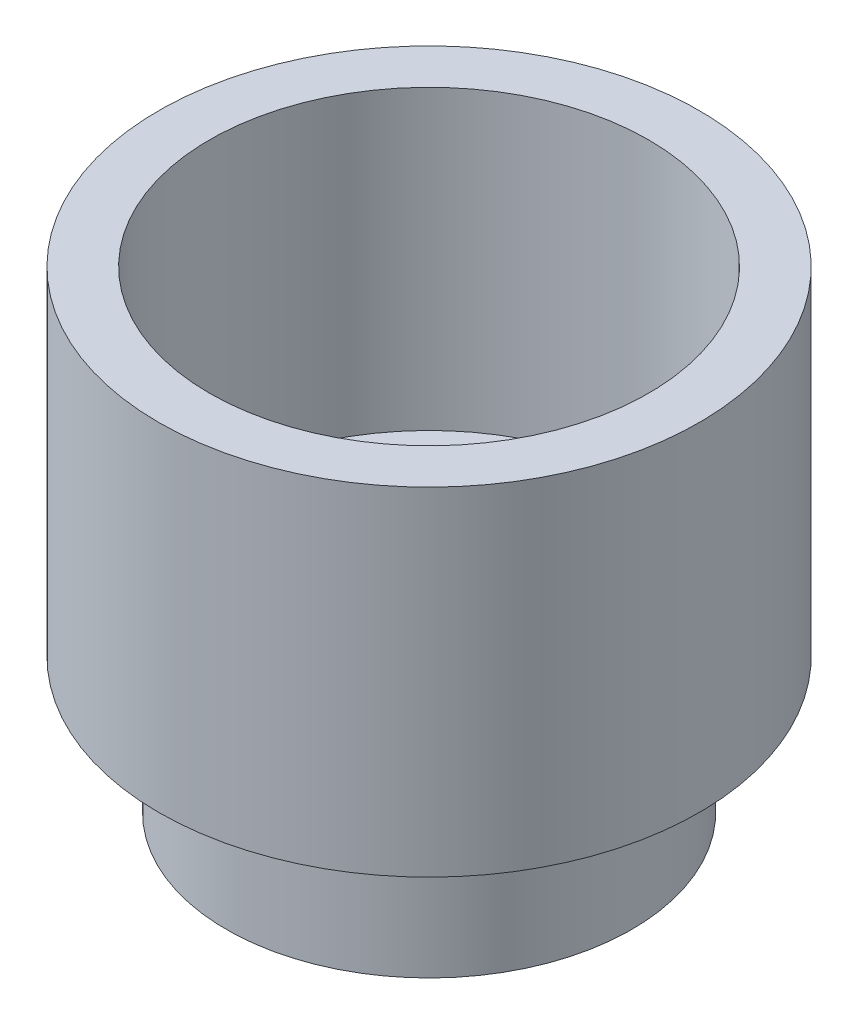
ISO-10303-21;
HEADER;
FILE_DESCRIPTION(('STEP AP214'),'2;1');
FILE_NAME('part.step','',(''),(''),'','','');
FILE_SCHEMA(('AUTOMOTIVE_DESIGN { 1 0 10303 214 1 1 1 1 }'));
ENDSEC;
DATA;
#1=APPLICATION_CONTEXT('core data for automotive mechanical design processes');
#2=APPLICATION_PROTOCOL_DEFINITION('international standard','automotive_design',2000,#1);
#3=PRODUCT_CONTEXT('',#1,'mechanical');
#4=PRODUCT('Part','Part','',(#3));
#5=PRODUCT_RELATED_PRODUCT_CATEGORY('part','',(#4));
#6=PRODUCT_DEFINITION_FORMATION('','',#4);
#7=PRODUCT_DEFINITION_CONTEXT('part definition',#1,'design');
#8=PRODUCT_DEFINITION('design','',#6,#7);
#9=PRODUCT_DEFINITION_SHAPE('','',#8);
#10=(LENGTH_UNIT() NAMED_UNIT(*) SI_UNIT(.MILLI.,.METRE.));
#11=(NAMED_UNIT(*) PLANE_ANGLE_UNIT() SI_UNIT($,.RADIAN.));
#12=(NAMED_UNIT(*) SI_UNIT($,.STERADIAN.) SOLID_ANGLE_UNIT());
#13=UNCERTAINTY_MEASURE_WITH_UNIT(LENGTH_MEASURE(1.E-05),#10,'distance_accuracy_value','');
#14=(GEOMETRIC_REPRESENTATION_CONTEXT(3) GLOBAL_UNCERTAINTY_ASSIGNED_CONTEXT((#13)) GLOBAL_UNIT_ASSIGNED_CONTEXT((#10,
#11,#12)) REPRESENTATION_CONTEXT('',''));
#15=CARTESIAN_POINT('',(0.,0.,0.));
#16=DIRECTION('',(0.,0.,1.));
#17=DIRECTION('',(1.,0.,0.));
#18=AXIS2_PLACEMENT_3D('',#15,#16,#17);
#19=CARTESIAN_POINT('',(0.,6.35,0.));
#20=DIRECTION('',(0.,-1.,0.));
#21=DIRECTION('',(0.,0.,-1.));
#22=AXIS2_PLACEMENT_3D('',#19,#20,#21);
#23=CYLINDRICAL_SURFACE('',#22,5.08);
#24=CARTESIAN_POINT('',(0.,6.35,0.));
#25=DIRECTION('',(0.,1.,0.));
#26=DIRECTION('',(0.,0.,1.));
#27=AXIS2_PLACEMENT_3D('',#24,#25,#26);
#28=CIRCLE('',#27,5.08);
#29=CARTESIAN_POINT('',(0.,6.35,5.08));
#30=VERTEX_POINT('',#29);
#31=EDGE_CURVE('E45',#30,#30,#28,.T.);
#32=ORIENTED_EDGE('',*,*,#31,.F.);
#33=EDGE_LOOP('',(#32));
#34=FACE_BOUND('',#33,.T.);
#35=CARTESIAN_POINT('',(0.,0.,0.));
#36=DIRECTION('',(0.,1.,0.));
#37=DIRECTION('',(0.,0.,1.));
#38=AXIS2_PLACEMENT_3D('',#35,#36,#37);
#39=CIRCLE('',#38,5.08);
#40=CARTESIAN_POINT('',(0.,0.,5.08));
#41=VERTEX_POINT('',#40);
#42=EDGE_CURVE('E40',#41,#41,#39,.T.);
#43=ORIENTED_EDGE('',*,*,#42,.T.);
#44=EDGE_LOOP('',(#43));
#45=FACE_BOUND('',#44,.T.);
#46=ADVANCED_FACE('F37',(#34,#45),#23,.T.);
#47=CARTESIAN_POINT('',(0.,6.35,0.));
#48=DIRECTION('',(0.,1.,0.));
#49=DIRECTION('',(0.,0.,1.));
#50=AXIS2_PLACEMENT_3D('',#47,#48,#49);
#51=PLANE('',#50);
#52=CARTESIAN_POINT('',(0.,6.35,0.));
#53=DIRECTION('',(0.,1.,0.));
#54=DIRECTION('',(0.,0.,1.));
#55=AXIS2_PLACEMENT_3D('',#52,#53,#54);
#56=CIRCLE('',#55,4.1275);
#57=CARTESIAN_POINT('',(0.,6.35,4.1275));
#58=VERTEX_POINT('',#57);
#59=EDGE_CURVE('E59',#58,#58,#56,.T.);
#60=ORIENTED_EDGE('',*,*,#59,.F.);
#61=EDGE_LOOP('',(#60));
#62=FACE_BOUND('',#61,.T.);
#63=ORIENTED_EDGE('',*,*,#31,.T.);
#64=EDGE_LOOP('',(#63));
#65=FACE_BOUND('',#64,.T.);
#66=ADVANCED_FACE('F96',(#62,#65),#51,.T.);
#67=CARTESIAN_POINT('',(0.,0.,0.));
#68=DIRECTION('',(0.,1.,0.));
#69=DIRECTION('',(0.,0.,1.));
#70=AXIS2_PLACEMENT_3D('',#67,#68,#69);
#71=PLANE('',#70);
#72=CARTESIAN_POINT('',(0.,0.,0.));
#73=DIRECTION('',(0.,-1.,0.));
#74=DIRECTION('',(0.,0.,-1.));
#75=AXIS2_PLACEMENT_3D('',#72,#73,#74);
#76=CIRCLE('',#75,3.81);
#77=CARTESIAN_POINT('',(0.,0.,-3.81));
#78=VERTEX_POINT('',#77);
#79=EDGE_CURVE('E10',#78,#78,#76,.T.);
#80=ORIENTED_EDGE('',*,*,#79,.F.);
#81=EDGE_LOOP('',(#80));
#82=FACE_BOUND('',#81,.T.);
#83=ORIENTED_EDGE('',*,*,#42,.F.);
#84=EDGE_LOOP('',(#83));
#85=FACE_BOUND('',#84,.T.);
#86=ADVANCED_FACE('F101',(#82,#85),#71,.F.);
#87=CARTESIAN_POINT('',(0.,0.762,0.));
#88=DIRECTION('',(0.,1.,0.));
#89=DIRECTION('',(0.,0.,1.));
#90=AXIS2_PLACEMENT_3D('',#87,#88,#89);
#91=CYLINDRICAL_SURFACE('',#90,4.1275);
#92=CARTESIAN_POINT('',(0.,0.762,0.));
#93=DIRECTION('',(0.,1.,0.));
#94=DIRECTION('',(0.,0.,1.));
#95=AXIS2_PLACEMENT_3D('',#92,#93,#94);
#96=CIRCLE('',#95,4.1275);
#97=CARTESIAN_POINT('',(0.,0.762,4.1275));
#98=VERTEX_POINT('',#97);
#99=EDGE_CURVE('E55',#98,#98,#96,.T.);
#100=ORIENTED_EDGE('',*,*,#99,.F.);
#101=EDGE_LOOP('',(#100));
#102=FACE_BOUND('',#101,.T.);
#103=ORIENTED_EDGE('',*,*,#59,.T.);
#104=EDGE_LOOP('',(#103));
#105=FACE_BOUND('',#104,.T.);
#106=ADVANCED_FACE('F111',(#102,#105),#91,.F.);
#107=CARTESIAN_POINT('',(0.,0.762,0.));
#108=DIRECTION('',(0.,1.,0.));
#109=DIRECTION('',(0.,0.,1.));
#110=AXIS2_PLACEMENT_3D('',#107,#108,#109);
#111=PLANE('',#110);
#112=ORIENTED_EDGE('',*,*,#99,.T.);
#113=EDGE_LOOP('',(#112));
#114=FACE_BOUND('',#113,.T.);
#115=ADVANCED_FACE('F92',(#114),#111,.T.);
#116=CARTESIAN_POINT('',(0.,-2.54,0.));
#117=DIRECTION('',(0.,1.,0.));
#118=DIRECTION('',(0.,0.,1.));
#119=AXIS2_PLACEMENT_3D('',#116,#117,#118);
#120=CYLINDRICAL_SURFACE('',#119,3.81);
#121=CARTESIAN_POINT('',(0.,-2.54,0.));
#122=DIRECTION('',(0.,-1.,0.));
#123=DIRECTION('',(0.,0.,-1.));
#124=AXIS2_PLACEMENT_3D('',#121,#122,#123);
#125=CIRCLE('',#124,3.81);
#126=CARTESIAN_POINT('',(0.,-2.54,-3.81));
#127=VERTEX_POINT('',#126);
#128=EDGE_CURVE('E53',#127,#127,#125,.T.);
#129=ORIENTED_EDGE('',*,*,#128,.F.);
#130=EDGE_LOOP('',(#129));
#131=FACE_BOUND('',#130,.T.);
#132=ORIENTED_EDGE('',*,*,#79,.T.);
#133=EDGE_LOOP('',(#132));
#134=FACE_BOUND('',#133,.T.);
#135=ADVANCED_FACE('F83',(#131,#134),#120,.T.);
#136=CARTESIAN_POINT('',(0.,-2.54,0.));
#137=DIRECTION('',(0.,-1.,0.));
#138=DIRECTION('',(0.,0.,-1.));
#139=AXIS2_PLACEMENT_3D('',#136,#137,#138);
#140=PLANE('',#139);
#141=CARTESIAN_POINT('',(0.,-2.54,0.));
#142=DIRECTION('',(0.,-1.,0.));
#143=DIRECTION('',(0.,0.,-1.));
#144=AXIS2_PLACEMENT_3D('',#141,#142,#143);
#145=CIRCLE('',#144,2.54);
#146=CARTESIAN_POINT('',(0.,-2.54,-2.54));
#147=VERTEX_POINT('',#146);
#148=EDGE_CURVE('E71',#147,#147,#145,.T.);
#149=ORIENTED_EDGE('',*,*,#148,.F.);
#150=EDGE_LOOP('',(#149));
#151=FACE_BOUND('',#150,.T.);
#152=ORIENTED_EDGE('',*,*,#128,.T.);
#153=EDGE_LOOP('',(#152));
#154=FACE_BOUND('',#153,.T.);
#155=ADVANCED_FACE('F81',(#151,#154),#140,.T.);
#156=CARTESIAN_POINT('',(0.,0.,0.));
#157=DIRECTION('',(0.,-1.,0.));
#158=DIRECTION('',(0.,0.,-1.));
#159=AXIS2_PLACEMENT_3D('',#156,#157,#158);
#160=CYLINDRICAL_SURFACE('',#159,2.54);
#161=CARTESIAN_POINT('',(0.,0.,0.));
#162=DIRECTION('',(0.,-1.,0.));
#163=DIRECTION('',(0.,0.,-1.));
#164=AXIS2_PLACEMENT_3D('',#161,#162,#163);
#165=CIRCLE('',#164,2.54);
#166=CARTESIAN_POINT('',(0.,0.,-2.54));
#167=VERTEX_POINT('',#166);
#168=EDGE_CURVE('E66',#167,#167,#165,.T.);
#169=ORIENTED_EDGE('',*,*,#168,.F.);
#170=EDGE_LOOP('',(#169));
#171=FACE_BOUND('',#170,.T.);
#172=ORIENTED_EDGE('',*,*,#148,.T.);
#173=EDGE_LOOP('',(#172));
#174=FACE_BOUND('',#173,.T.);
#175=ADVANCED_FACE('F79',(#171,#174),#160,.F.);
#176=CARTESIAN_POINT('',(0.,0.,0.));
#177=DIRECTION('',(0.,-1.,0.));
#178=DIRECTION('',(0.,0.,-1.));
#179=AXIS2_PLACEMENT_3D('',#176,#177,#178);
#180=PLANE('',#179);
#181=ORIENTED_EDGE('',*,*,#168,.T.);
#182=EDGE_LOOP('',(#181));
#183=FACE_BOUND('',#182,.T.);
#184=ADVANCED_FACE('F89',(#183),#180,.T.);
#185=CLOSED_SHELL('',(#46,#66,#86,#106,#115,#135,#155,#175,#184));
#186=MANIFOLD_SOLID_BREP('B2',#185);
#187=ADVANCED_BREP_SHAPE_REPRESENTATION('',(#18,#186),#14);
#188=SHAPE_DEFINITION_REPRESENTATION(#9,#187);
ENDSEC;
END-ISO-10303-21;
